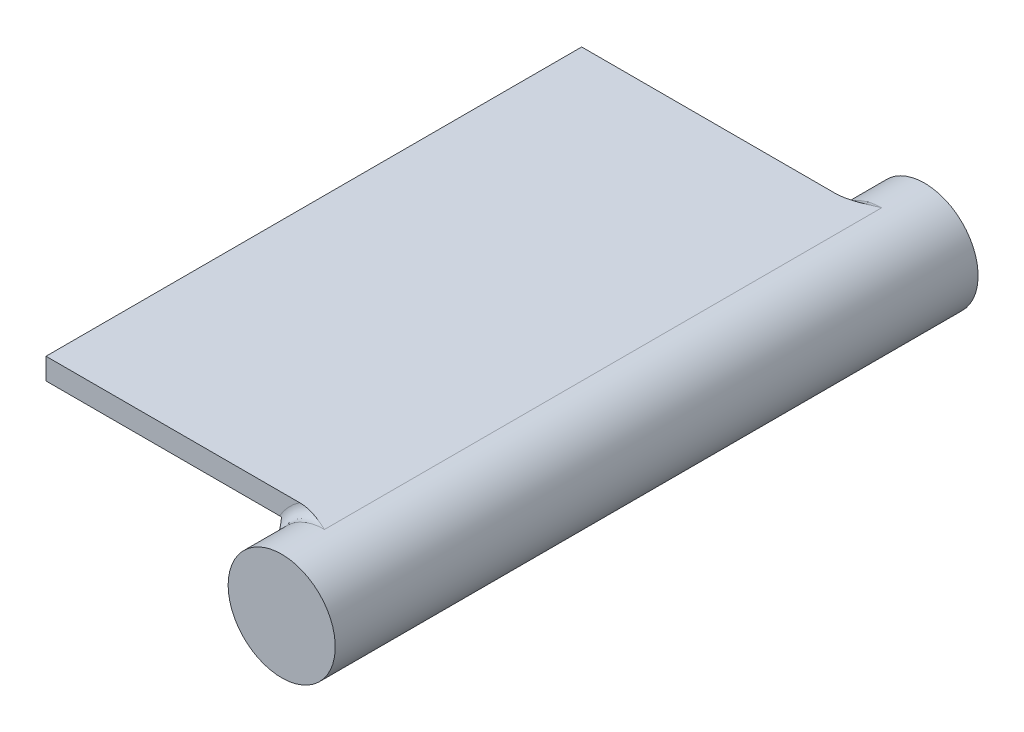
ISO-10303-21;
HEADER;
FILE_DESCRIPTION(('STEP AP214'),'2;1');
FILE_NAME('part.step','',(''),(''),'','','');
FILE_SCHEMA(('AUTOMOTIVE_DESIGN { 1 0 10303 214 1 1 1 1 }'));
ENDSEC;
DATA;
#1=APPLICATION_CONTEXT('core data for automotive mechanical design processes');
#2=APPLICATION_PROTOCOL_DEFINITION('international standard','automotive_design',2000,#1);
#3=PRODUCT_CONTEXT('',#1,'mechanical');
#4=PRODUCT('Part','Part','',(#3));
#5=PRODUCT_RELATED_PRODUCT_CATEGORY('part','',(#4));
#6=PRODUCT_DEFINITION_FORMATION('','',#4);
#7=PRODUCT_DEFINITION_CONTEXT('part definition',#1,'design');
#8=PRODUCT_DEFINITION('design','',#6,#7);
#9=PRODUCT_DEFINITION_SHAPE('','',#8);
#10=(LENGTH_UNIT() NAMED_UNIT(*) SI_UNIT(.MILLI.,.METRE.));
#11=(NAMED_UNIT(*) PLANE_ANGLE_UNIT() SI_UNIT($,.RADIAN.));
#12=(NAMED_UNIT(*) SI_UNIT($,.STERADIAN.) SOLID_ANGLE_UNIT());
#13=UNCERTAINTY_MEASURE_WITH_UNIT(LENGTH_MEASURE(1.E-05),#10,'distance_accuracy_value','');
#14=(GEOMETRIC_REPRESENTATION_CONTEXT(3) GLOBAL_UNCERTAINTY_ASSIGNED_CONTEXT((#13)) GLOBAL_UNIT_ASSIGNED_CONTEXT((#10,
#11,#12)) REPRESENTATION_CONTEXT('',''));
#15=CARTESIAN_POINT('',(0.,0.,0.));
#16=DIRECTION('',(0.,0.,1.));
#17=DIRECTION('',(1.,0.,0.));
#18=AXIS2_PLACEMENT_3D('',#15,#16,#17);
#19=CARTESIAN_POINT('',(6.,0.,25.));
#20=DIRECTION('',(1.,0.,0.));
#21=DIRECTION('',(0.,0.,-1.));
#22=AXIS2_PLACEMENT_3D('',#19,#20,#21);
#23=PLANE('',#22);
#24=DIRECTION('',(0.,0.,-1.));
#25=VECTOR('',#24,1.);
#26=CARTESIAN_POINT('',(6.,3.,25.));
#27=LINE('',#26,#25);
#28=CARTESIAN_POINT('',(6.,3.,25.0143921986187));
#29=VERTEX_POINT('',#28);
#30=CARTESIAN_POINT('',(6.,3.,9.));
#31=VERTEX_POINT('',#30);
#32=EDGE_CURVE('E212',#29,#31,#27,.T.);
#33=ORIENTED_EDGE('',*,*,#32,.T.);
#34=DIRECTION('',(0.,1.,0.));
#35=VECTOR('',#34,1.);
#36=CARTESIAN_POINT('',(6.,0.,9.));
#37=LINE('',#36,#35);
#38=CARTESIAN_POINT('',(6.,0.,9.));
#39=VERTEX_POINT('',#38);
#40=EDGE_CURVE('E354',#31,#39,#37,.F.);
#41=ORIENTED_EDGE('',*,*,#40,.T.);
#42=DIRECTION('',(0.,0.,-1.));
#43=VECTOR('',#42,1.);
#44=CARTESIAN_POINT('',(6.,0.,25.));
#45=LINE('',#44,#43);
#46=CARTESIAN_POINT('',(6.,0.,26.));
#47=VERTEX_POINT('',#46);
#48=EDGE_CURVE('E207',#47,#39,#45,.T.);
#49=ORIENTED_EDGE('',*,*,#48,.F.);
#50=CARTESIAN_POINT('',(6.,3.,25.0143921986187));
#51=CARTESIAN_POINT('',(6.,2.92629489229713,25.0209062694051));
#52=CARTESIAN_POINT('',(6.,2.85280035586006,25.0294569707577));
#53=CARTESIAN_POINT('',(6.,2.70636221730662,25.0501523543417));
#54=CARTESIAN_POINT('',(6.,2.63341829897618,25.0622947823696));
#55=CARTESIAN_POINT('',(6.,2.41589977123798,25.1033268441681));
#56=CARTESIAN_POINT('',(6.,2.27220048769227,25.1368655391808));
#57=CARTESIAN_POINT('',(6.,1.98852617114185,25.2130505099414));
#58=CARTESIAN_POINT('',(6.,1.84853081244084,25.2556235811347));
#59=CARTESIAN_POINT('',(6.,1.57076146811268,25.3477423893555));
#60=CARTESIAN_POINT('',(6.,1.43298930394268,25.3972935493872));
#61=CARTESIAN_POINT('',(6.,1.07907022802928,25.5319106665406));
#62=CARTESIAN_POINT('',(6.,0.86437992070786,25.6207525801454));
#63=CARTESIAN_POINT('',(6.,0.437420059014902,25.8044491779199));
#64=CARTESIAN_POINT('',(6.,0.225153158239583,25.8993098231616));
#65=CARTESIAN_POINT('',(6.,0.00860663069114139,25.9961509992853));
#66=CARTESIAN_POINT('',(6.,0.00430331587862235,25.9980755002491));
#67=CARTESIAN_POINT('',(6.,0.,26.));
#68=B_SPLINE_CURVE_WITH_KNOTS('',3,(#50,#51,#52,#53,#54,#55,#56,#57,#58,#59,#60,#61,#62,#63,#64,
#65,#66,#67),.UNSPECIFIED.,.F.,.F.,(4,2,2,2,2,2,2,2,4),(0.,0.221901956909679,0.44366494036939,
0.885875485417368,1.32463105211632,1.7637294978428,2.46052902581761,3.1580297892224,
3.17217192484615),.UNSPECIFIED.);
#69=EDGE_CURVE('E273',#47,#29,#68,.F.);
#70=ORIENTED_EDGE('',*,*,#69,.T.);
#71=EDGE_LOOP('',(#33,#41,#49,#70));
#72=FACE_BOUND('',#71,.T.);
#73=ADVANCED_FACE('F41',(#72),#23,.F.);
#74=CARTESIAN_POINT('',(6.,3.,25.));
#75=DIRECTION('',(0.,1.,0.));
#76=DIRECTION('',(0.,0.,1.));
#77=AXIS2_PLACEMENT_3D('',#74,#75,#76);
#78=PLANE('',#77);
#79=DIRECTION('',(-1.,0.,0.));
#80=VECTOR('',#79,1.);
#81=CARTESIAN_POINT('',(6.,3.,8.));
#82=LINE('',#81,#80);
#83=CARTESIAN_POINT('',(5.,3.,8.));
#84=VERTEX_POINT('',#83);
#85=CARTESIAN_POINT('',(-16.,3.,8.));
#86=VERTEX_POINT('',#85);
#87=EDGE_CURVE('E178',#84,#86,#82,.T.);
#88=ORIENTED_EDGE('',*,*,#87,.F.);
#89=CARTESIAN_POINT('',(5.,3.,9.));
#90=DIRECTION('',(0.,1.,0.));
#91=DIRECTION('',(0.,0.,1.));
#92=AXIS2_PLACEMENT_3D('',#89,#90,#91);
#93=CIRCLE('',#92,1.);
#94=EDGE_CURVE('E351',#84,#31,#93,.F.);
#95=ORIENTED_EDGE('',*,*,#94,.T.);
#96=ORIENTED_EDGE('',*,*,#32,.F.);
#97=CARTESIAN_POINT('',(6.,3.,25.0143921986187));
#98=CARTESIAN_POINT('',(5.96748328717582,3.,25.0096065355376));
#99=CARTESIAN_POINT('',(5.93487900529311,3.,25.0060143541512));
#100=CARTESIAN_POINT('',(5.86949486673032,3.,25.0012169227276));
#101=CARTESIAN_POINT('',(5.83671500771082,3.,25.0000117045744));
#102=CARTESIAN_POINT('',(5.80384757729337,3.,25.));
#103=B_SPLINE_CURVE_WITH_KNOTS('',3,(#97,#98,#99,#100,#101,#102),.UNSPECIFIED.,.F.,.F.,(4,2,4),
(0.,0.098404708615989,0.196810731669537),.UNSPECIFIED.);
#104=CARTESIAN_POINT('',(5.80384757729336,3.,25.));
#105=VERTEX_POINT('',#104);
#106=EDGE_CURVE('E294',#29,#105,#103,.T.);
#107=ORIENTED_EDGE('',*,*,#106,.T.);
#108=DIRECTION('',(1.,0.,0.));
#109=VECTOR('',#108,1.);
#110=CARTESIAN_POINT('',(6.,3.,25.));
#111=LINE('',#110,#109);
#112=CARTESIAN_POINT('',(-16.,3.,25.));
#113=VERTEX_POINT('',#112);
#114=EDGE_CURVE('E199',#113,#105,#111,.T.);
#115=ORIENTED_EDGE('',*,*,#114,.F.);
#116=DIRECTION('',(0.,0.,-1.));
#117=VECTOR('',#116,1.);
#118=CARTESIAN_POINT('',(-16.,3.,25.));
#119=LINE('',#118,#117);
#120=EDGE_CURVE('E217',#113,#86,#119,.T.);
#121=ORIENTED_EDGE('',*,*,#120,.T.);
#122=EDGE_LOOP('',(#88,#95,#96,#107,#115,#121));
#123=FACE_BOUND('',#122,.T.);
#124=ADVANCED_FACE('F315',(#123),#78,.F.);
#125=CARTESIAN_POINT('',(-16.,5.,25.));
#126=DIRECTION('',(0.,-1.,0.));
#127=DIRECTION('',(0.,0.,-1.));
#128=AXIS2_PLACEMENT_3D('',#125,#126,#127);
#129=PLANE('',#128);
#130=DIRECTION('',(-1.,0.,0.));
#131=VECTOR('',#130,1.);
#132=CARTESIAN_POINT('',(-16.,5.,25.));
#133=LINE('',#132,#131);
#134=CARTESIAN_POINT('',(7.6833752096446,5.,25.));
#135=VERTEX_POINT('',#134);
#136=CARTESIAN_POINT('',(-16.,5.,25.));
#137=VERTEX_POINT('',#136);
#138=EDGE_CURVE('E225',#135,#137,#133,.T.);
#139=ORIENTED_EDGE('',*,*,#138,.F.);
#140=CARTESIAN_POINT('',(7.6833752096446,5.,25.));
#141=CARTESIAN_POINT('',(7.74505517380976,5.,25.0000073448778));
#142=CARTESIAN_POINT('',(7.80671037187208,5.,25.0017426295204));
#143=CARTESIAN_POINT('',(7.92982152338826,5.,25.0083207227693));
#144=CARTESIAN_POINT('',(7.99127757217821,5.,25.0131617158651));
#145=CARTESIAN_POINT('',(8.17486686936751,5.,25.0317877579638));
#146=CARTESIAN_POINT('',(8.29658842987213,5.,25.0496800784524));
#147=CARTESIAN_POINT('',(8.53702711584741,5.,25.0939613378526));
#148=CARTESIAN_POINT('',(8.65576254932752,5.,25.1202549836714));
#149=CARTESIAN_POINT('',(8.89158538215638,5.,25.1796974773276));
#150=CARTESIAN_POINT('',(9.00867132040548,5.,25.212852039063));
#151=CARTESIAN_POINT('',(9.28448875901095,5.,25.2979248994134));
#152=CARTESIAN_POINT('',(9.44247615811581,5.,25.3522308971437));
#153=CARTESIAN_POINT('',(9.7558444952943,5.,25.4679560521697));
#154=CARTESIAN_POINT('',(9.91122430294559,5.,25.5293782076369));
#155=CARTESIAN_POINT('',(10.3753699632935,5.,25.7207361591975));
#156=CARTESIAN_POINT('',(10.6812841793297,5.,25.8574670446344));
#157=CARTESIAN_POINT('',(10.9913933812025,5.,25.9961510169498));
#158=CARTESIAN_POINT('',(10.9956966961922,5.,25.9980755182051));
#159=CARTESIAN_POINT('',(11.,5.,26.));
#160=B_SPLINE_CURVE_WITH_KNOTS('',3,(#140,#141,#142,#143,#144,#145,#146,#147,#148,#149,#150,
#151,#152,#153,#154,#155,#156,#157,#158,#159),.UNSPECIFIED.,.F.,.F.,(4,2,2,2,2,2,2,2,2,4),(0.,
0.184977192336638,0.369846350577207,0.73848758309854,1.10308764090451,1.46799257532018,
1.96890994139298,2.47003912618645,3.47501470229638,3.48915683792114),.UNSPECIFIED.);
#161=CARTESIAN_POINT('',(11.,5.,26.));
#162=VERTEX_POINT('',#161);
#163=EDGE_CURVE('E263',#135,#162,#160,.T.);
#164=ORIENTED_EDGE('',*,*,#163,.T.);
#165=DIRECTION('',(0.,0.,-1.));
#166=VECTOR('',#165,1.);
#167=CARTESIAN_POINT('',(11.,5.,25.));
#168=LINE('',#167,#166);
#169=CARTESIAN_POINT('',(11.,5.,-26.));
#170=VERTEX_POINT('',#169);
#171=EDGE_CURVE('E243',#162,#170,#168,.T.);
#172=ORIENTED_EDGE('',*,*,#171,.T.);
#173=CARTESIAN_POINT('',(7.6833752096446,5.,-25.));
#174=CARTESIAN_POINT('',(7.74505517380976,5.,-25.0000073448778));
#175=CARTESIAN_POINT('',(7.80671037187208,5.,-25.0017426295204));
#176=CARTESIAN_POINT('',(7.92982152338826,5.,-25.0083207227693));
#177=CARTESIAN_POINT('',(7.99127757217821,5.,-25.0131617158651));
#178=CARTESIAN_POINT('',(8.17486686936751,5.,-25.0317877579638));
#179=CARTESIAN_POINT('',(8.29658842987213,5.,-25.0496800784524));
#180=CARTESIAN_POINT('',(8.53702711584741,5.,-25.0939613378526));
#181=CARTESIAN_POINT('',(8.65576254932752,5.,-25.1202549836714));
#182=CARTESIAN_POINT('',(8.89158538215638,5.,-25.1796974773276));
#183=CARTESIAN_POINT('',(9.00867132040548,5.,-25.212852039063));
#184=CARTESIAN_POINT('',(9.28448875901095,5.,-25.2979248994134));
#185=CARTESIAN_POINT('',(9.44247615811581,5.,-25.3522308971437));
#186=CARTESIAN_POINT('',(9.7558444952943,5.,-25.4679560521697));
#187=CARTESIAN_POINT('',(9.91122430294559,5.,-25.5293782076369));
#188=CARTESIAN_POINT('',(10.3753699632935,5.,-25.7207361591975));
#189=CARTESIAN_POINT('',(10.6812841793297,5.,-25.8574670446344));
#190=CARTESIAN_POINT('',(10.9913933812025,5.,-25.9961510169498));
#191=CARTESIAN_POINT('',(10.9956966961922,5.,-25.9980755182051));
#192=CARTESIAN_POINT('',(11.,5.,-26.));
#193=B_SPLINE_CURVE_WITH_KNOTS('',3,(#173,#174,#175,#176,#177,#178,#179,#180,#181,#182,#183,
#184,#185,#186,#187,#188,#189,#190,#191,#192),.UNSPECIFIED.,.F.,.F.,(4,2,2,2,2,2,2,2,2,4),(0.,
0.184977192336638,0.369846350577207,0.73848758309854,1.10308764090451,1.46799257532018,
1.96890994139298,2.47003912618645,3.47501470229638,3.48915683792114),.UNSPECIFIED.);
#194=CARTESIAN_POINT('',(7.6833752096446,5.,-25.));
#195=VERTEX_POINT('',#194);
#196=EDGE_CURVE('E302',#170,#195,#193,.F.);
#197=ORIENTED_EDGE('',*,*,#196,.T.);
#198=DIRECTION('',(-1.,0.,0.));
#199=VECTOR('',#198,1.);
#200=CARTESIAN_POINT('',(-16.,5.,-25.));
#201=LINE('',#200,#199);
#202=CARTESIAN_POINT('',(-16.,5.,-25.));
#203=VERTEX_POINT('',#202);
#204=EDGE_CURVE('E234',#195,#203,#201,.T.);
#205=ORIENTED_EDGE('',*,*,#204,.T.);
#206=DIRECTION('',(0.,0.,-1.));
#207=VECTOR('',#206,1.);
#208=CARTESIAN_POINT('',(-16.,5.,25.));
#209=LINE('',#208,#207);
#210=EDGE_CURVE('E233',#137,#203,#209,.T.);
#211=ORIENTED_EDGE('',*,*,#210,.F.);
#212=EDGE_LOOP('',(#139,#164,#172,#197,#205,#211));
#213=FACE_BOUND('',#212,.T.);
#214=ADVANCED_FACE('F280',(#213),#129,.F.);
#215=CARTESIAN_POINT('',(-16.,-5.,25.));
#216=DIRECTION('',(1.,0.,0.));
#217=DIRECTION('',(0.,0.,-1.));
#218=AXIS2_PLACEMENT_3D('',#215,#216,#217);
#219=PLANE('',#218);
#220=DIRECTION('',(0.,-1.,0.));
#221=VECTOR('',#220,1.);
#222=CARTESIAN_POINT('',(-16.,-5.,-25.));
#223=LINE('',#222,#221);
#224=CARTESIAN_POINT('',(-16.,3.,-25.));
#225=VERTEX_POINT('',#224);
#226=EDGE_CURVE('E229',#203,#225,#223,.T.);
#227=ORIENTED_EDGE('',*,*,#226,.T.);
#228=CARTESIAN_POINT('',(-16.,3.,-8.));
#229=VERTEX_POINT('',#228);
#230=EDGE_CURVE('E203',#229,#225,#119,.T.);
#231=ORIENTED_EDGE('',*,*,#230,.F.);
#232=DIRECTION('',(0.,0.,1.));
#233=VECTOR('',#232,1.);
#234=CARTESIAN_POINT('',(-16.,3.,-8.));
#235=LINE('',#234,#233);
#236=EDGE_CURVE('E192',#229,#86,#235,.T.);
#237=ORIENTED_EDGE('',*,*,#236,.T.);
#238=ORIENTED_EDGE('',*,*,#120,.F.);
#239=DIRECTION('',(0.,-1.,0.));
#240=VECTOR('',#239,1.);
#241=CARTESIAN_POINT('',(-16.,-5.,25.));
#242=LINE('',#241,#240);
#243=EDGE_CURVE('E228',#137,#113,#242,.T.);
#244=ORIENTED_EDGE('',*,*,#243,.F.);
#245=ORIENTED_EDGE('',*,*,#210,.T.);
#246=EDGE_LOOP('',(#227,#231,#237,#238,#244,#245));
#247=FACE_BOUND('',#246,.T.);
#248=ADVANCED_FACE('F383',(#247),#219,.F.);
#249=CARTESIAN_POINT('',(0.,0.,25.));
#250=DIRECTION('',(0.,0.,-1.));
#251=DIRECTION('',(-1.,0.,0.));
#252=AXIS2_PLACEMENT_3D('',#249,#250,#251);
#253=PLANE('',#252);
#254=ORIENTED_EDGE('',*,*,#114,.T.);
#255=CARTESIAN_POINT('',(11.,0.,25.));
#256=DIRECTION('',(0.,0.,-1.));
#257=DIRECTION('',(-1.,0.,0.));
#258=AXIS2_PLACEMENT_3D('',#255,#256,#257);
#259=CIRCLE('',#258,6.);
#260=EDGE_CURVE('E246',#105,#135,#259,.T.);
#261=ORIENTED_EDGE('',*,*,#260,.T.);
#262=ORIENTED_EDGE('',*,*,#138,.T.);
#263=ORIENTED_EDGE('',*,*,#243,.T.);
#264=EDGE_LOOP('',(#254,#261,#262,#263));
#265=FACE_BOUND('',#264,.T.);
#266=ADVANCED_FACE('F405',(#265),#253,.F.);
#267=CARTESIAN_POINT('',(0.,0.,-25.));
#268=DIRECTION('',(0.,0.,-1.));
#269=DIRECTION('',(-1.,0.,0.));
#270=AXIS2_PLACEMENT_3D('',#267,#268,#269);
#271=PLANE('',#270);
#272=ORIENTED_EDGE('',*,*,#204,.F.);
#273=CARTESIAN_POINT('',(11.,0.,-25.));
#274=DIRECTION('',(0.,0.,-1.));
#275=DIRECTION('',(-1.,0.,0.));
#276=AXIS2_PLACEMENT_3D('',#273,#274,#275);
#277=CIRCLE('',#276,6.);
#278=CARTESIAN_POINT('',(5.80384757729336,3.,-25.));
#279=VERTEX_POINT('',#278);
#280=EDGE_CURVE('E260',#195,#279,#277,.F.);
#281=ORIENTED_EDGE('',*,*,#280,.T.);
#282=DIRECTION('',(1.,0.,0.));
#283=VECTOR('',#282,1.);
#284=CARTESIAN_POINT('',(6.,3.,-25.));
#285=LINE('',#284,#283);
#286=EDGE_CURVE('E195',#225,#279,#285,.T.);
#287=ORIENTED_EDGE('',*,*,#286,.F.);
#288=ORIENTED_EDGE('',*,*,#226,.F.);
#289=EDGE_LOOP('',(#272,#281,#287,#288));
#290=FACE_BOUND('',#289,.T.);
#291=ADVANCED_FACE('F381',(#290),#271,.T.);
#292=CARTESIAN_POINT('',(11.,0.,25.));
#293=DIRECTION('',(0.,0.,-1.));
#294=DIRECTION('',(-1.,0.,0.));
#295=AXIS2_PLACEMENT_3D('',#292,#293,#294);
#296=CYLINDRICAL_SURFACE('',#295,5.);
#297=ORIENTED_EDGE('',*,*,#171,.F.);
#298=CARTESIAN_POINT('',(11.,0.,26.));
#299=DIRECTION('',(0.,0.,-1.));
#300=DIRECTION('',(-1.,0.,0.));
#301=AXIS2_PLACEMENT_3D('',#298,#299,#300);
#302=CIRCLE('',#301,5.);
#303=EDGE_CURVE('E256',#162,#47,#302,.F.);
#304=ORIENTED_EDGE('',*,*,#303,.T.);
#305=ORIENTED_EDGE('',*,*,#48,.T.);
#306=DIRECTION('',(0.,0.,1.));
#307=VECTOR('',#306,1.);
#308=CARTESIAN_POINT('',(6.,0.,-8.));
#309=LINE('',#308,#307);
#310=CARTESIAN_POINT('',(6.,0.,-9.));
#311=VERTEX_POINT('',#310);
#312=EDGE_CURVE('E57',#311,#39,#309,.T.);
#313=ORIENTED_EDGE('',*,*,#312,.F.);
#314=CARTESIAN_POINT('',(6.,0.,-26.));
#315=VERTEX_POINT('',#314);
#316=EDGE_CURVE('E211',#311,#315,#45,.T.);
#317=ORIENTED_EDGE('',*,*,#316,.T.);
#318=CARTESIAN_POINT('',(11.,0.,-26.));
#319=DIRECTION('',(0.,0.,-1.));
#320=DIRECTION('',(-1.,0.,0.));
#321=AXIS2_PLACEMENT_3D('',#318,#319,#320);
#322=CIRCLE('',#321,5.);
#323=EDGE_CURVE('E252',#315,#170,#322,.T.);
#324=ORIENTED_EDGE('',*,*,#323,.T.);
#325=EDGE_LOOP('',(#297,#304,#305,#313,#317,#324));
#326=FACE_BOUND('',#325,.T.);
#327=DIRECTION('',(0.,0.,-1.));
#328=VECTOR('',#327,1.);
#329=CARTESIAN_POINT('',(16.,0.,25.));
#330=LINE('',#329,#328);
#331=CARTESIAN_POINT('',(16.,0.,-25.));
#332=VERTEX_POINT('',#331);
#333=CARTESIAN_POINT('',(16.,0.,25.));
#334=VERTEX_POINT('',#333);
#335=EDGE_CURVE('E224',#332,#334,#330,.F.);
#336=ORIENTED_EDGE('',*,*,#335,.T.);
#337=ORIENTED_EDGE('',*,*,#335,.F.);
#338=EDGE_LOOP('',(#336,#337));
#339=FACE_BOUND('',#338,.T.);
#340=CARTESIAN_POINT('',(11.,0.,-30.));
#341=DIRECTION('',(0.,0.,-1.));
#342=DIRECTION('',(-1.,0.,0.));
#343=AXIS2_PLACEMENT_3D('',#340,#341,#342);
#344=CIRCLE('',#343,5.);
#345=CARTESIAN_POINT('',(6.,0.,-30.));
#346=VERTEX_POINT('',#345);
#347=EDGE_CURVE('E210',#346,#346,#344,.T.);
#348=ORIENTED_EDGE('',*,*,#347,.F.);
#349=EDGE_LOOP('',(#348));
#350=FACE_BOUND('',#349,.T.);
#351=CARTESIAN_POINT('',(11.,0.,30.));
#352=DIRECTION('',(0.,0.,-1.));
#353=DIRECTION('',(-1.,0.,0.));
#354=AXIS2_PLACEMENT_3D('',#351,#352,#353);
#355=CIRCLE('',#354,5.);
#356=CARTESIAN_POINT('',(6.,0.,30.));
#357=VERTEX_POINT('',#356);
#358=EDGE_CURVE('E173',#357,#357,#355,.T.);
#359=ORIENTED_EDGE('',*,*,#358,.T.);
#360=EDGE_LOOP('',(#359));
#361=FACE_BOUND('',#360,.T.);
#362=ADVANCED_FACE('F290',(#326,#339,#350,#361),#296,.T.);
#363=CARTESIAN_POINT('',(11.,0.,-30.));
#364=DIRECTION('',(0.,0.,-1.));
#365=DIRECTION('',(-1.,0.,0.));
#366=AXIS2_PLACEMENT_3D('',#363,#364,#365);
#367=PLANE('',#366);
#368=CARTESIAN_POINT('',(11.,0.,-30.));
#369=DIRECTION('',(0.,0.,-1.));
#370=DIRECTION('',(-1.,0.,0.));
#371=AXIS2_PLACEMENT_3D('',#368,#369,#370);
#372=CIRCLE('',#371,4.);
#373=CARTESIAN_POINT('',(13.6457513110646,3.,-30.));
#374=VERTEX_POINT('',#373);
#375=CARTESIAN_POINT('',(8.3542486889354,3.,-30.));
#376=VERTEX_POINT('',#375);
#377=EDGE_CURVE('E150',#374,#376,#372,.T.);
#378=ORIENTED_EDGE('',*,*,#377,.F.);
#379=DIRECTION('',(1.,0.,0.));
#380=VECTOR('',#379,1.);
#381=CARTESIAN_POINT('',(13.6457513110646,3.,-30.));
#382=LINE('',#381,#380);
#383=EDGE_CURVE('E162',#376,#374,#382,.T.);
#384=ORIENTED_EDGE('',*,*,#383,.F.);
#385=EDGE_LOOP('',(#378,#384));
#386=FACE_BOUND('',#385,.T.);
#387=ORIENTED_EDGE('',*,*,#347,.T.);
#388=EDGE_LOOP('',(#387));
#389=FACE_BOUND('',#388,.T.);
#390=ADVANCED_FACE('F318',(#386,#389),#367,.T.);
#391=ORIENTED_EDGE('',*,*,#316,.F.);
#392=DIRECTION('',(0.,1.,0.));
#393=VECTOR('',#392,1.);
#394=CARTESIAN_POINT('',(6.,0.,-9.));
#395=LINE('',#394,#393);
#396=CARTESIAN_POINT('',(6.,3.,-9.));
#397=VERTEX_POINT('',#396);
#398=EDGE_CURVE('E337',#311,#397,#395,.T.);
#399=ORIENTED_EDGE('',*,*,#398,.T.);
#400=CARTESIAN_POINT('',(6.,3.,-25.0143921986187));
#401=VERTEX_POINT('',#400);
#402=EDGE_CURVE('E216',#397,#401,#27,.T.);
#403=ORIENTED_EDGE('',*,*,#402,.T.);
#404=CARTESIAN_POINT('',(6.,3.,-25.0143921986187));
#405=CARTESIAN_POINT('',(6.,2.92629489229713,-25.0209062694051));
#406=CARTESIAN_POINT('',(6.,2.85280035586006,-25.0294569707577));
#407=CARTESIAN_POINT('',(6.,2.70636221730662,-25.0501523543417));
#408=CARTESIAN_POINT('',(6.,2.63341829897618,-25.0622947823696));
#409=CARTESIAN_POINT('',(6.,2.41589977123798,-25.1033268441681));
#410=CARTESIAN_POINT('',(6.,2.27220048769227,-25.1368655391808));
#411=CARTESIAN_POINT('',(6.,1.98852617114185,-25.2130505099414));
#412=CARTESIAN_POINT('',(6.,1.84853081244084,-25.2556235811347));
#413=CARTESIAN_POINT('',(6.,1.57076146811268,-25.3477423893555));
#414=CARTESIAN_POINT('',(6.,1.43298930394268,-25.3972935493872));
#415=CARTESIAN_POINT('',(6.,1.07907022802928,-25.5319106665406));
#416=CARTESIAN_POINT('',(6.,0.86437992070786,-25.6207525801454));
#417=CARTESIAN_POINT('',(6.,0.437420059014902,-25.8044491779199));
#418=CARTESIAN_POINT('',(6.,0.225153158239583,-25.8993098231616));
#419=CARTESIAN_POINT('',(6.,0.00860663069114139,-25.9961509992853));
#420=CARTESIAN_POINT('',(6.,0.00430331587862235,-25.9980755002491));
#421=CARTESIAN_POINT('',(6.,0.,-26.));
#422=B_SPLINE_CURVE_WITH_KNOTS('',3,(#404,#405,#406,#407,#408,#409,#410,#411,#412,#413,#414,
#415,#416,#417,#418,#419,#420,#421),.UNSPECIFIED.,.F.,.F.,(4,2,2,2,2,2,2,2,4),(0.,
0.221901956909679,0.44366494036939,0.885875485417368,1.32463105211632,1.7637294978428,
2.46052902581761,3.1580297892224,3.17217192484615),.UNSPECIFIED.);
#423=EDGE_CURVE('E329',#401,#315,#422,.T.);
#424=ORIENTED_EDGE('',*,*,#423,.T.);
#425=EDGE_LOOP('',(#391,#399,#403,#424));
#426=FACE_BOUND('',#425,.T.);
#427=ADVANCED_FACE('F313',(#426),#23,.F.);
#428=ORIENTED_EDGE('',*,*,#402,.F.);
#429=CARTESIAN_POINT('',(5.,3.,-9.));
#430=DIRECTION('',(0.,1.,0.));
#431=DIRECTION('',(0.,0.,1.));
#432=AXIS2_PLACEMENT_3D('',#429,#430,#431);
#433=CIRCLE('',#432,1.);
#434=CARTESIAN_POINT('',(5.,3.,-8.));
#435=VERTEX_POINT('',#434);
#436=EDGE_CURVE('E341',#397,#435,#433,.F.);
#437=ORIENTED_EDGE('',*,*,#436,.T.);
#438=DIRECTION('',(-1.,0.,0.));
#439=VECTOR('',#438,1.);
#440=CARTESIAN_POINT('',(6.,3.,-8.));
#441=LINE('',#440,#439);
#442=EDGE_CURVE('E185',#435,#229,#441,.T.);
#443=ORIENTED_EDGE('',*,*,#442,.T.);
#444=ORIENTED_EDGE('',*,*,#230,.T.);
#445=ORIENTED_EDGE('',*,*,#286,.T.);
#446=CARTESIAN_POINT('',(5.80384757729336,3.,-25.));
#447=CARTESIAN_POINT('',(5.83671500771082,3.,-25.0000117045744));
#448=CARTESIAN_POINT('',(5.86949486673031,3.,-25.0012169227277));
#449=CARTESIAN_POINT('',(5.93487900529311,3.,-25.0060143541512));
#450=CARTESIAN_POINT('',(5.96748328717582,3.,-25.0096065355375));
#451=CARTESIAN_POINT('',(6.,3.,-25.0143921986186));
#452=B_SPLINE_CURVE_WITH_KNOTS('',3,(#446,#447,#448,#449,#450,#451),.UNSPECIFIED.,.F.,.F.,(4,2,
4),(0.,0.0984060230535453,0.196810731669526),.UNSPECIFIED.);
#453=EDGE_CURVE('E321',#279,#401,#452,.T.);
#454=ORIENTED_EDGE('',*,*,#453,.T.);
#455=EDGE_LOOP('',(#428,#437,#443,#444,#445,#454));
#456=FACE_BOUND('',#455,.T.);
#457=ADVANCED_FACE('F308',(#456),#78,.F.);
#458=CARTESIAN_POINT('',(-16.,3.,-8.));
#459=DIRECTION('',(-0.135113204733313,-0.990830168044299,0.));
#460=DIRECTION('',(0.990830168044299,-0.135113204733313,0.));
#461=AXIS2_PLACEMENT_3D('',#458,#459,#460);
#462=PLANE('',#461);
#463=ORIENTED_EDGE('',*,*,#312,.T.);
#464=CARTESIAN_POINT('',(5.,0.136363636363654,9.));
#465=DIRECTION('',(-0.135113204733313,-0.990830168044299,0.));
#466=DIRECTION('',(0.990830168044299,-0.135113204733313,0.));
#467=AXIS2_PLACEMENT_3D('',#464,#465,#466);
#468=ELLIPSE('',#467,1.00925469596248,1.);
#469=CARTESIAN_POINT('',(4.99999999999999,0.136363636363654,8.));
#470=VERTEX_POINT('',#469);
#471=EDGE_CURVE('E11',#39,#470,#468,.F.);
#472=ORIENTED_EDGE('',*,*,#471,.T.);
#473=DIRECTION('',(0.990830168044299,-0.135113204733313,0.));
#474=VECTOR('',#473,1.);
#475=CARTESIAN_POINT('',(-16.,3.,8.));
#476=LINE('',#475,#474);
#477=EDGE_CURVE('E181',#86,#470,#476,.T.);
#478=ORIENTED_EDGE('',*,*,#477,.F.);
#479=ORIENTED_EDGE('',*,*,#236,.F.);
#480=DIRECTION('',(0.990830168044299,-0.135113204733313,0.));
#481=VECTOR('',#480,1.);
#482=CARTESIAN_POINT('',(-16.,3.,-8.));
#483=LINE('',#482,#481);
#484=CARTESIAN_POINT('',(4.99999999999999,0.136363636363654,-8.));
#485=VERTEX_POINT('',#484);
#486=EDGE_CURVE('E188',#229,#485,#483,.T.);
#487=ORIENTED_EDGE('',*,*,#486,.T.);
#488=CARTESIAN_POINT('',(5.,0.136363636363654,-9.));
#489=DIRECTION('',(-0.135113204733313,-0.990830168044299,0.));
#490=DIRECTION('',(-0.990830168044299,0.135113204733313,0.));
#491=AXIS2_PLACEMENT_3D('',#488,#489,#490);
#492=ELLIPSE('',#491,1.00925469596248,1.);
#493=EDGE_CURVE('E51',#485,#311,#492,.F.);
#494=ORIENTED_EDGE('',*,*,#493,.T.);
#495=EDGE_LOOP('',(#463,#472,#478,#479,#487,#494));
#496=FACE_BOUND('',#495,.T.);
#497=ADVANCED_FACE('F312',(#496),#462,.T.);
#498=CARTESIAN_POINT('',(0.,0.,-8.));
#499=DIRECTION('',(0.,0.,-1.));
#500=DIRECTION('',(-1.,0.,0.));
#501=AXIS2_PLACEMENT_3D('',#498,#499,#500);
#502=PLANE('',#501);
#503=ORIENTED_EDGE('',*,*,#442,.F.);
#504=DIRECTION('',(0.,1.,0.));
#505=VECTOR('',#504,1.);
#506=CARTESIAN_POINT('',(5.,0.,-8.));
#507=LINE('',#506,#505);
#508=EDGE_CURVE('E344',#435,#485,#507,.F.);
#509=ORIENTED_EDGE('',*,*,#508,.T.);
#510=ORIENTED_EDGE('',*,*,#486,.F.);
#511=EDGE_LOOP('',(#503,#509,#510));
#512=FACE_BOUND('',#511,.T.);
#513=ADVANCED_FACE('F439',(#512),#502,.T.);
#514=CARTESIAN_POINT('',(0.,0.,8.));
#515=DIRECTION('',(0.,0.,-1.));
#516=DIRECTION('',(-1.,0.,0.));
#517=AXIS2_PLACEMENT_3D('',#514,#515,#516);
#518=PLANE('',#517);
#519=ORIENTED_EDGE('',*,*,#477,.T.);
#520=DIRECTION('',(0.,1.,0.));
#521=VECTOR('',#520,1.);
#522=CARTESIAN_POINT('',(5.,3.,8.));
#523=LINE('',#522,#521);
#524=EDGE_CURVE('E347',#470,#84,#523,.T.);
#525=ORIENTED_EDGE('',*,*,#524,.T.);
#526=ORIENTED_EDGE('',*,*,#87,.T.);
#527=EDGE_LOOP('',(#519,#525,#526));
#528=FACE_BOUND('',#527,.T.);
#529=ADVANCED_FACE('F432',(#528),#518,.F.);
#530=CARTESIAN_POINT('',(11.,0.,30.));
#531=DIRECTION('',(0.,0.,1.));
#532=DIRECTION('',(-1.,0.,0.));
#533=AXIS2_PLACEMENT_3D('',#530,#531,#532);
#534=PLANE('',#533);
#535=ORIENTED_EDGE('',*,*,#358,.F.);
#536=EDGE_LOOP('',(#535));
#537=FACE_BOUND('',#536,.T.);
#538=ADVANCED_FACE('F430',(#537),#534,.T.);
#539=CARTESIAN_POINT('',(11.,0.,-21.5));
#540=DIRECTION('',(0.,0.,-1.));
#541=DIRECTION('',(-1.,0.,0.));
#542=AXIS2_PLACEMENT_3D('',#539,#540,#541);
#543=CYLINDRICAL_SURFACE('',#542,4.);
#544=ORIENTED_EDGE('',*,*,#377,.T.);
#545=DIRECTION('',(0.,0.,-1.));
#546=VECTOR('',#545,1.);
#547=CARTESIAN_POINT('',(8.3542486889354,3.,-21.5));
#548=LINE('',#547,#546);
#549=CARTESIAN_POINT('',(8.3542486889354,3.,-21.5));
#550=VERTEX_POINT('',#549);
#551=EDGE_CURVE('E144',#550,#376,#548,.T.);
#552=ORIENTED_EDGE('',*,*,#551,.F.);
#553=CARTESIAN_POINT('',(11.,0.,-21.5));
#554=DIRECTION('',(0.,0.,-1.));
#555=DIRECTION('',(-1.,0.,0.));
#556=AXIS2_PLACEMENT_3D('',#553,#554,#555);
#557=CIRCLE('',#556,4.);
#558=CARTESIAN_POINT('',(13.6457513110646,3.,-21.5));
#559=VERTEX_POINT('',#558);
#560=EDGE_CURVE('E147',#559,#550,#557,.T.);
#561=ORIENTED_EDGE('',*,*,#560,.F.);
#562=DIRECTION('',(0.,0.,-1.));
#563=VECTOR('',#562,1.);
#564=CARTESIAN_POINT('',(13.6457513110646,3.,-21.5));
#565=LINE('',#564,#563);
#566=EDGE_CURVE('E156',#559,#374,#565,.T.);
#567=ORIENTED_EDGE('',*,*,#566,.T.);
#568=EDGE_LOOP('',(#544,#552,#561,#567));
#569=FACE_BOUND('',#568,.T.);
#570=ADVANCED_FACE('F146',(#569),#543,.F.);
#571=CARTESIAN_POINT('',(13.6457513110646,3.,-21.5));
#572=DIRECTION('',(0.,1.,0.));
#573=DIRECTION('',(0.,0.,1.));
#574=AXIS2_PLACEMENT_3D('',#571,#572,#573);
#575=PLANE('',#574);
#576=ORIENTED_EDGE('',*,*,#383,.T.);
#577=ORIENTED_EDGE('',*,*,#566,.F.);
#578=DIRECTION('',(1.,0.,0.));
#579=VECTOR('',#578,1.);
#580=CARTESIAN_POINT('',(13.6457513110646,3.,-21.5));
#581=LINE('',#580,#579);
#582=EDGE_CURVE('E157',#550,#559,#581,.T.);
#583=ORIENTED_EDGE('',*,*,#582,.F.);
#584=ORIENTED_EDGE('',*,*,#551,.T.);
#585=EDGE_LOOP('',(#576,#577,#583,#584));
#586=FACE_BOUND('',#585,.T.);
#587=ADVANCED_FACE('F164',(#586),#575,.F.);
#588=CARTESIAN_POINT('',(11.,0.,-21.5));
#589=DIRECTION('',(0.,0.,-1.));
#590=DIRECTION('',(-1.,0.,0.));
#591=AXIS2_PLACEMENT_3D('',#588,#589,#590);
#592=PLANE('',#591);
#593=ORIENTED_EDGE('',*,*,#560,.T.);
#594=ORIENTED_EDGE('',*,*,#582,.T.);
#595=EDGE_LOOP('',(#593,#594));
#596=FACE_BOUND('',#595,.T.);
#597=ADVANCED_FACE('F160',(#596),#592,.T.);
#598=CARTESIAN_POINT('',(11.,0.,26.));
#599=DIRECTION('',(0.,0.,-1.));
#600=DIRECTION('',(-1.,0.,0.));
#601=AXIS2_PLACEMENT_3D('',#598,#599,#600);
#602=TOROIDAL_SURFACE('',#601,6.,1.);
#603=ORIENTED_EDGE('',*,*,#69,.F.);
#604=ORIENTED_EDGE('',*,*,#303,.F.);
#605=ORIENTED_EDGE('',*,*,#163,.F.);
#606=ORIENTED_EDGE('',*,*,#260,.F.);
#607=ORIENTED_EDGE('',*,*,#106,.F.);
#608=EDGE_LOOP('',(#603,#604,#605,#606,#607));
#609=FACE_BOUND('',#608,.T.);
#610=ADVANCED_FACE('F284',(#609),#602,.F.);
#611=CARTESIAN_POINT('',(11.,0.,-26.));
#612=DIRECTION('',(0.,0.,-1.));
#613=DIRECTION('',(-1.,0.,0.));
#614=AXIS2_PLACEMENT_3D('',#611,#612,#613);
#615=TOROIDAL_SURFACE('',#614,6.,1.);
#616=ORIENTED_EDGE('',*,*,#453,.F.);
#617=ORIENTED_EDGE('',*,*,#280,.F.);
#618=ORIENTED_EDGE('',*,*,#196,.F.);
#619=ORIENTED_EDGE('',*,*,#323,.F.);
#620=ORIENTED_EDGE('',*,*,#423,.F.);
#621=EDGE_LOOP('',(#616,#617,#618,#619,#620));
#622=FACE_BOUND('',#621,.T.);
#623=ADVANCED_FACE('F288',(#622),#615,.F.);
#624=CARTESIAN_POINT('',(5.,0.,-9.));
#625=DIRECTION('',(0.,1.,0.));
#626=DIRECTION('',(0.,0.,1.));
#627=AXIS2_PLACEMENT_3D('',#624,#625,#626);
#628=CYLINDRICAL_SURFACE('',#627,1.);
#629=ORIENTED_EDGE('',*,*,#493,.F.);
#630=ORIENTED_EDGE('',*,*,#508,.F.);
#631=ORIENTED_EDGE('',*,*,#436,.F.);
#632=ORIENTED_EDGE('',*,*,#398,.F.);
#633=EDGE_LOOP('',(#629,#630,#631,#632));
#634=FACE_BOUND('',#633,.T.);
#635=ADVANCED_FACE('F366',(#634),#628,.F.);
#636=CARTESIAN_POINT('',(5.,0.,9.));
#637=DIRECTION('',(0.,-1.,0.));
#638=DIRECTION('',(0.,0.,-1.));
#639=AXIS2_PLACEMENT_3D('',#636,#637,#638);
#640=CYLINDRICAL_SURFACE('',#639,1.);
#641=ORIENTED_EDGE('',*,*,#471,.F.);
#642=ORIENTED_EDGE('',*,*,#40,.F.);
#643=ORIENTED_EDGE('',*,*,#94,.F.);
#644=ORIENTED_EDGE('',*,*,#524,.F.);
#645=EDGE_LOOP('',(#641,#642,#643,#644));
#646=FACE_BOUND('',#645,.T.);
#647=ADVANCED_FACE('F43',(#646),#640,.F.);
#648=CLOSED_SHELL('',(#73,#124,#214,#248,#266,#291,#362,#390,#427,#457,#497,#513,#529,#538,#570,
#587,#597,#610,#623,#635,#647));
#649=MANIFOLD_SOLID_BREP('B2',#648);
#650=ADVANCED_BREP_SHAPE_REPRESENTATION('',(#18,#649),#14);
#651=SHAPE_DEFINITION_REPRESENTATION(#9,#650);
ENDSEC;
END-ISO-10303-21;
